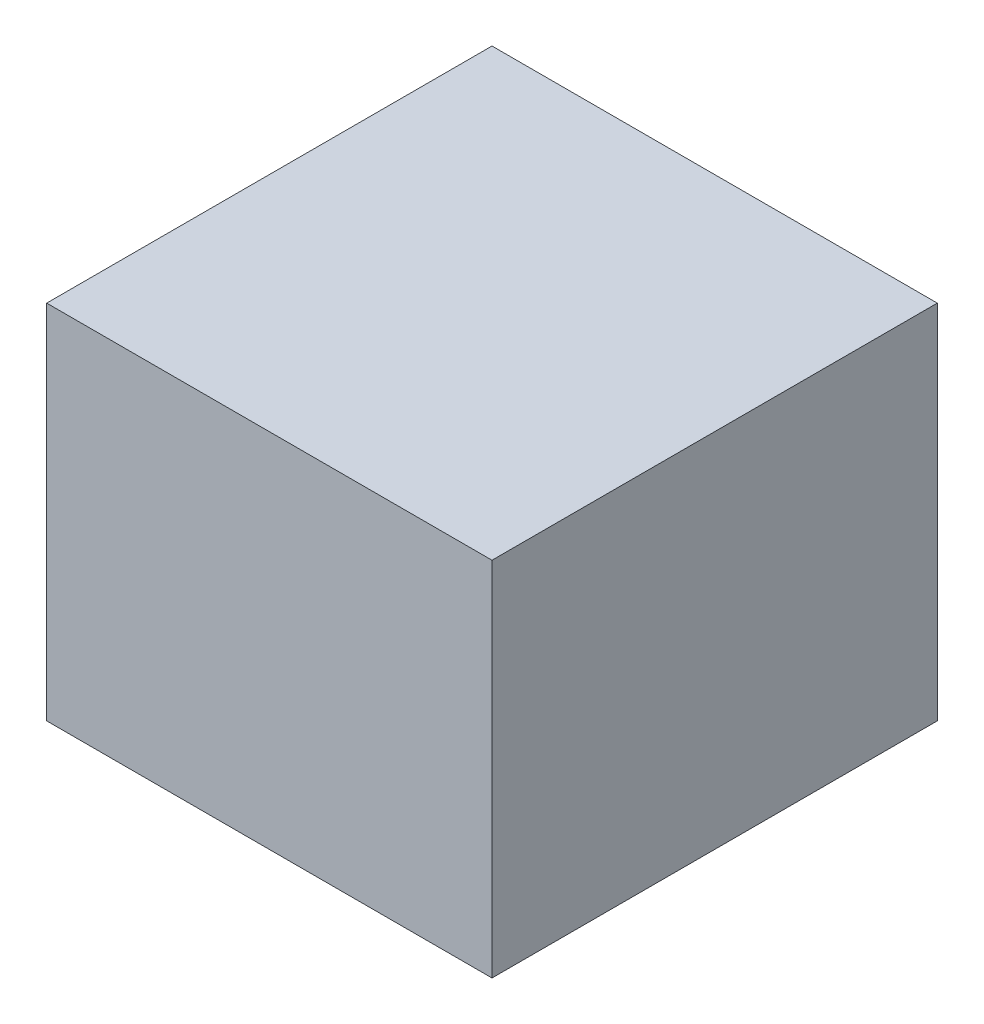
ISO-10303-21;
HEADER;
FILE_DESCRIPTION(('STEP AP214'),'2;1');
FILE_NAME('part.step','',(''),(''),'','','');
FILE_SCHEMA(('AUTOMOTIVE_DESIGN { 1 0 10303 214 1 1 1 1 }'));
ENDSEC;
DATA;
#1=APPLICATION_CONTEXT('core data for automotive mechanical design processes');
#2=APPLICATION_PROTOCOL_DEFINITION('international standard','automotive_design',2000,#1);
#3=PRODUCT_CONTEXT('',#1,'mechanical');
#4=PRODUCT('Part','Part','',(#3));
#5=PRODUCT_RELATED_PRODUCT_CATEGORY('part','',(#4));
#6=PRODUCT_DEFINITION_FORMATION('','',#4);
#7=PRODUCT_DEFINITION_CONTEXT('part definition',#1,'design');
#8=PRODUCT_DEFINITION('design','',#6,#7);
#9=PRODUCT_DEFINITION_SHAPE('','',#8);
#10=(LENGTH_UNIT() NAMED_UNIT(*) SI_UNIT(.MILLI.,.METRE.));
#11=(NAMED_UNIT(*) PLANE_ANGLE_UNIT() SI_UNIT($,.RADIAN.));
#12=(NAMED_UNIT(*) SI_UNIT($,.STERADIAN.) SOLID_ANGLE_UNIT());
#13=UNCERTAINTY_MEASURE_WITH_UNIT(LENGTH_MEASURE(1.E-05),#10,'distance_accuracy_value','');
#14=(GEOMETRIC_REPRESENTATION_CONTEXT(3) GLOBAL_UNCERTAINTY_ASSIGNED_CONTEXT((#13)) GLOBAL_UNIT_ASSIGNED_CONTEXT((#10,
#11,#12)) REPRESENTATION_CONTEXT('',''));
#15=CARTESIAN_POINT('',(0.,0.,0.));
#16=DIRECTION('',(0.,0.,1.));
#17=DIRECTION('',(1.,0.,0.));
#18=AXIS2_PLACEMENT_3D('',#15,#16,#17);
#19=CARTESIAN_POINT('',(4.,6.5,4.));
#20=DIRECTION('',(-1.,0.,0.));
#21=DIRECTION('',(0.,0.,1.));
#22=AXIS2_PLACEMENT_3D('',#19,#20,#21);
#23=PLANE('',#22);
#24=DIRECTION('',(0.,0.,-1.));
#25=VECTOR('',#24,1.);
#26=CARTESIAN_POINT('',(4.,0.,4.));
#27=LINE('',#26,#25);
#28=CARTESIAN_POINT('',(4.,0.,4.));
#29=VERTEX_POINT('',#28);
#30=CARTESIAN_POINT('',(4.,0.,-4.));
#31=VERTEX_POINT('',#30);
#32=EDGE_CURVE('E113',#29,#31,#27,.T.);
#33=ORIENTED_EDGE('',*,*,#32,.T.);
#34=DIRECTION('',(0.,-1.,0.));
#35=VECTOR('',#34,1.);
#36=CARTESIAN_POINT('',(4.,6.5,-4.));
#37=LINE('',#36,#35);
#38=CARTESIAN_POINT('',(4.,6.5,-4.));
#39=VERTEX_POINT('',#38);
#40=EDGE_CURVE('E11',#39,#31,#37,.T.);
#41=ORIENTED_EDGE('',*,*,#40,.F.);
#42=DIRECTION('',(0.,0.,-1.));
#43=VECTOR('',#42,1.);
#44=CARTESIAN_POINT('',(4.,6.5,4.));
#45=LINE('',#44,#43);
#46=CARTESIAN_POINT('',(4.,6.5,4.));
#47=VERTEX_POINT('',#46);
#48=EDGE_CURVE('E97',#47,#39,#45,.T.);
#49=ORIENTED_EDGE('',*,*,#48,.F.);
#50=DIRECTION('',(0.,-1.,0.));
#51=VECTOR('',#50,1.);
#52=CARTESIAN_POINT('',(4.,6.5,4.));
#53=LINE('',#52,#51);
#54=EDGE_CURVE('E109',#47,#29,#53,.T.);
#55=ORIENTED_EDGE('',*,*,#54,.T.);
#56=EDGE_LOOP('',(#33,#41,#49,#55));
#57=FACE_BOUND('',#56,.T.);
#58=ADVANCED_FACE('F45',(#57),#23,.F.);
#59=CARTESIAN_POINT('',(-4.,6.5,-4.));
#60=DIRECTION('',(0.,0.,1.));
#61=DIRECTION('',(1.,0.,0.));
#62=AXIS2_PLACEMENT_3D('',#59,#60,#61);
#63=PLANE('',#62);
#64=DIRECTION('',(-1.,0.,0.));
#65=VECTOR('',#64,1.);
#66=CARTESIAN_POINT('',(-4.,0.,-4.));
#67=LINE('',#66,#65);
#68=CARTESIAN_POINT('',(-4.,0.,-4.));
#69=VERTEX_POINT('',#68);
#70=EDGE_CURVE('E102',#31,#69,#67,.T.);
#71=ORIENTED_EDGE('',*,*,#70,.T.);
#72=DIRECTION('',(0.,-1.,0.));
#73=VECTOR('',#72,1.);
#74=CARTESIAN_POINT('',(-4.,6.5,-4.));
#75=LINE('',#74,#73);
#76=CARTESIAN_POINT('',(-4.,6.5,-4.));
#77=VERTEX_POINT('',#76);
#78=EDGE_CURVE('E54',#77,#69,#75,.T.);
#79=ORIENTED_EDGE('',*,*,#78,.F.);
#80=DIRECTION('',(-1.,0.,0.));
#81=VECTOR('',#80,1.);
#82=CARTESIAN_POINT('',(-4.,6.5,-4.));
#83=LINE('',#82,#81);
#84=EDGE_CURVE('E92',#39,#77,#83,.T.);
#85=ORIENTED_EDGE('',*,*,#84,.F.);
#86=ORIENTED_EDGE('',*,*,#40,.T.);
#87=EDGE_LOOP('',(#71,#79,#85,#86));
#88=FACE_BOUND('',#87,.T.);
#89=ADVANCED_FACE('F101',(#88),#63,.F.);
#90=CARTESIAN_POINT('',(-4.,6.5,4.));
#91=DIRECTION('',(1.,0.,0.));
#92=DIRECTION('',(0.,0.,-1.));
#93=AXIS2_PLACEMENT_3D('',#90,#91,#92);
#94=PLANE('',#93);
#95=DIRECTION('',(0.,0.,1.));
#96=VECTOR('',#95,1.);
#97=CARTESIAN_POINT('',(-4.,0.,4.));
#98=LINE('',#97,#96);
#99=CARTESIAN_POINT('',(-4.,0.,4.));
#100=VERTEX_POINT('',#99);
#101=EDGE_CURVE('E79',#69,#100,#98,.T.);
#102=ORIENTED_EDGE('',*,*,#101,.T.);
#103=DIRECTION('',(0.,-1.,0.));
#104=VECTOR('',#103,1.);
#105=CARTESIAN_POINT('',(-4.,6.5,4.));
#106=LINE('',#105,#104);
#107=CARTESIAN_POINT('',(-4.,6.5,4.));
#108=VERTEX_POINT('',#107);
#109=EDGE_CURVE('E104',#108,#100,#106,.T.);
#110=ORIENTED_EDGE('',*,*,#109,.F.);
#111=DIRECTION('',(0.,0.,1.));
#112=VECTOR('',#111,1.);
#113=CARTESIAN_POINT('',(-4.,6.5,4.));
#114=LINE('',#113,#112);
#115=EDGE_CURVE('E95',#77,#108,#114,.T.);
#116=ORIENTED_EDGE('',*,*,#115,.F.);
#117=ORIENTED_EDGE('',*,*,#78,.T.);
#118=EDGE_LOOP('',(#102,#110,#116,#117));
#119=FACE_BOUND('',#118,.T.);
#120=ADVANCED_FACE('F105',(#119),#94,.F.);
#121=CARTESIAN_POINT('',(-4.,6.5,4.));
#122=DIRECTION('',(0.,0.,-1.));
#123=DIRECTION('',(-1.,0.,0.));
#124=AXIS2_PLACEMENT_3D('',#121,#122,#123);
#125=PLANE('',#124);
#126=DIRECTION('',(1.,0.,0.));
#127=VECTOR('',#126,1.);
#128=CARTESIAN_POINT('',(-4.,0.,4.));
#129=LINE('',#128,#127);
#130=EDGE_CURVE('E85',#100,#29,#129,.T.);
#131=ORIENTED_EDGE('',*,*,#130,.T.);
#132=ORIENTED_EDGE('',*,*,#54,.F.);
#133=DIRECTION('',(1.,0.,0.));
#134=VECTOR('',#133,1.);
#135=CARTESIAN_POINT('',(-4.,6.5,4.));
#136=LINE('',#135,#134);
#137=EDGE_CURVE('E62',#108,#47,#136,.T.);
#138=ORIENTED_EDGE('',*,*,#137,.F.);
#139=ORIENTED_EDGE('',*,*,#109,.T.);
#140=EDGE_LOOP('',(#131,#132,#138,#139));
#141=FACE_BOUND('',#140,.T.);
#142=ADVANCED_FACE('F126',(#141),#125,.F.);
#143=CARTESIAN_POINT('',(0.,6.5,0.));
#144=DIRECTION('',(0.,-1.,0.));
#145=DIRECTION('',(0.,0.,-1.));
#146=AXIS2_PLACEMENT_3D('',#143,#144,#145);
#147=PLANE('',#146);
#148=ORIENTED_EDGE('',*,*,#48,.T.);
#149=ORIENTED_EDGE('',*,*,#84,.T.);
#150=ORIENTED_EDGE('',*,*,#115,.T.);
#151=ORIENTED_EDGE('',*,*,#137,.T.);
#152=EDGE_LOOP('',(#148,#149,#150,#151));
#153=FACE_BOUND('',#152,.T.);
#154=ADVANCED_FACE('F93',(#153),#147,.F.);
#155=CARTESIAN_POINT('',(0.,0.,0.));
#156=DIRECTION('',(0.,-1.,0.));
#157=DIRECTION('',(0.,0.,-1.));
#158=AXIS2_PLACEMENT_3D('',#155,#156,#157);
#159=PLANE('',#158);
#160=ORIENTED_EDGE('',*,*,#32,.F.);
#161=ORIENTED_EDGE('',*,*,#130,.F.);
#162=ORIENTED_EDGE('',*,*,#101,.F.);
#163=ORIENTED_EDGE('',*,*,#70,.F.);
#164=EDGE_LOOP('',(#160,#161,#162,#163));
#165=FACE_BOUND('',#164,.T.);
#166=ADVANCED_FACE('F129',(#165),#159,.T.);
#167=CLOSED_SHELL('',(#58,#89,#120,#142,#154,#166));
#168=MANIFOLD_SOLID_BREP('B2',#167);
#169=ADVANCED_BREP_SHAPE_REPRESENTATION('',(#18,#168),#14);
#170=SHAPE_DEFINITION_REPRESENTATION(#9,#169);
ENDSEC;
END-ISO-10303-21;
